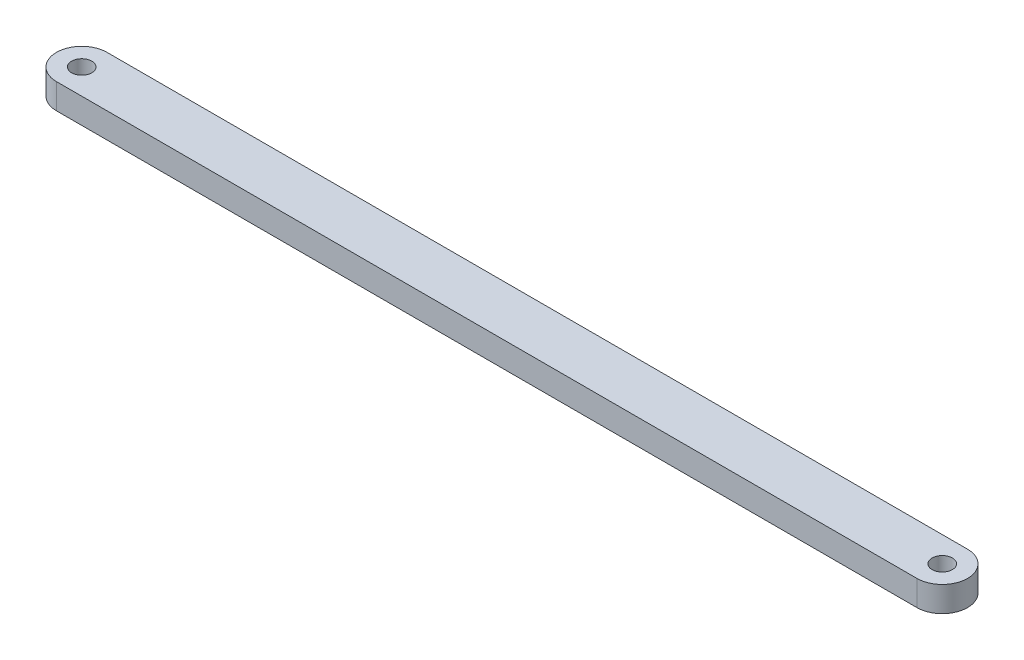
ISO-10303-21;
HEADER;
FILE_DESCRIPTION(('STEP AP214'),'2;1');
FILE_NAME('part.step','',(''),(''),'','','');
FILE_SCHEMA(('AUTOMOTIVE_DESIGN { 1 0 10303 214 1 1 1 1 }'));
ENDSEC;
DATA;
#1=APPLICATION_CONTEXT('core data for automotive mechanical design processes');
#2=APPLICATION_PROTOCOL_DEFINITION('international standard','automotive_design',2000,#1);
#3=PRODUCT_CONTEXT('',#1,'mechanical');
#4=PRODUCT('Part','Part','',(#3));
#5=PRODUCT_RELATED_PRODUCT_CATEGORY('part','',(#4));
#6=PRODUCT_DEFINITION_FORMATION('','',#4);
#7=PRODUCT_DEFINITION_CONTEXT('part definition',#1,'design');
#8=PRODUCT_DEFINITION('design','',#6,#7);
#9=PRODUCT_DEFINITION_SHAPE('','',#8);
#10=(LENGTH_UNIT() NAMED_UNIT(*) SI_UNIT(.MILLI.,.METRE.));
#11=(NAMED_UNIT(*) PLANE_ANGLE_UNIT() SI_UNIT($,.RADIAN.));
#12=(NAMED_UNIT(*) SI_UNIT($,.STERADIAN.) SOLID_ANGLE_UNIT());
#13=UNCERTAINTY_MEASURE_WITH_UNIT(LENGTH_MEASURE(1.E-05),#10,'distance_accuracy_value','');
#14=(GEOMETRIC_REPRESENTATION_CONTEXT(3) GLOBAL_UNCERTAINTY_ASSIGNED_CONTEXT((#13)) GLOBAL_UNIT_ASSIGNED_CONTEXT((#10,
#11,#12)) REPRESENTATION_CONTEXT('',''));
#15=CARTESIAN_POINT('',(0.,0.,0.));
#16=DIRECTION('',(0.,0.,1.));
#17=DIRECTION('',(1.,0.,0.));
#18=AXIS2_PLACEMENT_3D('',#15,#16,#17);
#19=CARTESIAN_POINT('',(0.,5.,-5.));
#20=DIRECTION('',(0.,-1.,0.));
#21=DIRECTION('',(0.,0.,-1.));
#22=AXIS2_PLACEMENT_3D('',#19,#20,#21);
#23=CYLINDRICAL_SURFACE('',#22,5.);
#24=CARTESIAN_POINT('',(0.,0.,-5.));
#25=DIRECTION('',(0.,1.,0.));
#26=DIRECTION('',(0.,0.,1.));
#27=AXIS2_PLACEMENT_3D('',#24,#25,#26);
#28=CIRCLE('',#27,5.);
#29=CARTESIAN_POINT('',(0.,0.,0.));
#30=VERTEX_POINT('',#29);
#31=CARTESIAN_POINT('',(0.,0.,-10.));
#32=VERTEX_POINT('',#31);
#33=EDGE_CURVE('E100',#30,#32,#28,.T.);
#34=ORIENTED_EDGE('',*,*,#33,.T.);
#35=DIRECTION('',(0.,-1.,0.));
#36=VECTOR('',#35,1.);
#37=CARTESIAN_POINT('',(0.,5.,-10.));
#38=LINE('',#37,#36);
#39=CARTESIAN_POINT('',(0.,5.,-10.));
#40=VERTEX_POINT('',#39);
#41=EDGE_CURVE('E11',#40,#32,#38,.T.);
#42=ORIENTED_EDGE('',*,*,#41,.F.);
#43=CARTESIAN_POINT('',(0.,5.,-5.));
#44=DIRECTION('',(0.,1.,0.));
#45=DIRECTION('',(0.,0.,1.));
#46=AXIS2_PLACEMENT_3D('',#43,#44,#45);
#47=CIRCLE('',#46,5.);
#48=CARTESIAN_POINT('',(0.,5.,0.));
#49=VERTEX_POINT('',#48);
#50=EDGE_CURVE('E88',#49,#40,#47,.T.);
#51=ORIENTED_EDGE('',*,*,#50,.F.);
#52=DIRECTION('',(0.,-1.,0.));
#53=VECTOR('',#52,1.);
#54=CARTESIAN_POINT('',(0.,5.,0.));
#55=LINE('',#54,#53);
#56=EDGE_CURVE('E96',#49,#30,#55,.T.);
#57=ORIENTED_EDGE('',*,*,#56,.T.);
#58=EDGE_LOOP('',(#34,#42,#51,#57));
#59=FACE_BOUND('',#58,.T.);
#60=ADVANCED_FACE('F37',(#59),#23,.T.);
#61=CARTESIAN_POINT('',(-170.,5.,-10.));
#62=DIRECTION('',(0.,0.,1.));
#63=DIRECTION('',(1.,0.,0.));
#64=AXIS2_PLACEMENT_3D('',#61,#62,#63);
#65=PLANE('',#64);
#66=DIRECTION('',(-1.,0.,0.));
#67=VECTOR('',#66,1.);
#68=CARTESIAN_POINT('',(-170.,0.,-10.));
#69=LINE('',#68,#67);
#70=CARTESIAN_POINT('',(-170.,0.,-10.));
#71=VERTEX_POINT('',#70);
#72=EDGE_CURVE('E92',#32,#71,#69,.T.);
#73=ORIENTED_EDGE('',*,*,#72,.T.);
#74=DIRECTION('',(0.,-1.,0.));
#75=VECTOR('',#74,1.);
#76=CARTESIAN_POINT('',(-170.,5.,-10.));
#77=LINE('',#76,#75);
#78=CARTESIAN_POINT('',(-170.,5.,-10.));
#79=VERTEX_POINT('',#78);
#80=EDGE_CURVE('E45',#79,#71,#77,.T.);
#81=ORIENTED_EDGE('',*,*,#80,.F.);
#82=DIRECTION('',(-1.,0.,0.));
#83=VECTOR('',#82,1.);
#84=CARTESIAN_POINT('',(-170.,5.,-10.));
#85=LINE('',#84,#83);
#86=EDGE_CURVE('E83',#40,#79,#85,.T.);
#87=ORIENTED_EDGE('',*,*,#86,.F.);
#88=ORIENTED_EDGE('',*,*,#41,.T.);
#89=EDGE_LOOP('',(#73,#81,#87,#88));
#90=FACE_BOUND('',#89,.T.);
#91=ADVANCED_FACE('F91',(#90),#65,.F.);
#92=CARTESIAN_POINT('',(-170.,5.,-4.99999999999999));
#93=DIRECTION('',(0.,-1.,0.));
#94=DIRECTION('',(0.,0.,-1.));
#95=AXIS2_PLACEMENT_3D('',#92,#93,#94);
#96=CYLINDRICAL_SURFACE('',#95,5.00000000000001);
#97=CARTESIAN_POINT('',(-170.,0.,-4.99999999999999));
#98=DIRECTION('',(0.,1.,0.));
#99=DIRECTION('',(0.,0.,1.));
#100=AXIS2_PLACEMENT_3D('',#97,#98,#99);
#101=CIRCLE('',#100,5.00000000000001);
#102=CARTESIAN_POINT('',(-170.,0.,0.));
#103=VERTEX_POINT('',#102);
#104=EDGE_CURVE('E70',#71,#103,#101,.T.);
#105=ORIENTED_EDGE('',*,*,#104,.T.);
#106=DIRECTION('',(0.,-1.,0.));
#107=VECTOR('',#106,1.);
#108=CARTESIAN_POINT('',(-170.,5.,0.));
#109=LINE('',#108,#107);
#110=CARTESIAN_POINT('',(-170.,5.,0.));
#111=VERTEX_POINT('',#110);
#112=EDGE_CURVE('E93',#111,#103,#109,.T.);
#113=ORIENTED_EDGE('',*,*,#112,.F.);
#114=CARTESIAN_POINT('',(-170.,5.,-4.99999999999999));
#115=DIRECTION('',(0.,1.,0.));
#116=DIRECTION('',(0.,0.,1.));
#117=AXIS2_PLACEMENT_3D('',#114,#115,#116);
#118=CIRCLE('',#117,5.00000000000001);
#119=EDGE_CURVE('E86',#79,#111,#118,.T.);
#120=ORIENTED_EDGE('',*,*,#119,.F.);
#121=ORIENTED_EDGE('',*,*,#80,.T.);
#122=EDGE_LOOP('',(#105,#113,#120,#121));
#123=FACE_BOUND('',#122,.T.);
#124=ADVANCED_FACE('F94',(#123),#96,.T.);
#125=CARTESIAN_POINT('',(0.,5.,0.));
#126=DIRECTION('',(0.,0.,-1.));
#127=DIRECTION('',(-1.,0.,0.));
#128=AXIS2_PLACEMENT_3D('',#125,#126,#127);
#129=PLANE('',#128);
#130=DIRECTION('',(1.,0.,0.));
#131=VECTOR('',#130,1.);
#132=CARTESIAN_POINT('',(0.,0.,0.));
#133=LINE('',#132,#131);
#134=EDGE_CURVE('E76',#103,#30,#133,.T.);
#135=ORIENTED_EDGE('',*,*,#134,.T.);
#136=ORIENTED_EDGE('',*,*,#56,.F.);
#137=DIRECTION('',(1.,0.,0.));
#138=VECTOR('',#137,1.);
#139=CARTESIAN_POINT('',(0.,5.,0.));
#140=LINE('',#139,#138);
#141=EDGE_CURVE('E53',#111,#49,#140,.T.);
#142=ORIENTED_EDGE('',*,*,#141,.F.);
#143=ORIENTED_EDGE('',*,*,#112,.T.);
#144=EDGE_LOOP('',(#135,#136,#142,#143));
#145=FACE_BOUND('',#144,.T.);
#146=ADVANCED_FACE('F108',(#145),#129,.F.);
#147=CARTESIAN_POINT('',(0.,5.,-5.));
#148=DIRECTION('',(0.,1.,0.));
#149=DIRECTION('',(0.,0.,1.));
#150=AXIS2_PLACEMENT_3D('',#147,#148,#149);
#151=PLANE('',#150);
#152=CARTESIAN_POINT('',(-170.,5.,-4.99999999999999));
#153=DIRECTION('',(0.,1.,0.));
#154=DIRECTION('',(0.,0.,1.));
#155=AXIS2_PLACEMENT_3D('',#152,#153,#154);
#156=CIRCLE('',#155,2.);
#157=CARTESIAN_POINT('',(-170.,5.,-2.99999999999999));
#158=VERTEX_POINT('',#157);
#159=EDGE_CURVE('E120',#158,#158,#156,.T.);
#160=ORIENTED_EDGE('',*,*,#159,.F.);
#161=EDGE_LOOP('',(#160));
#162=FACE_BOUND('',#161,.T.);
#163=CARTESIAN_POINT('',(0.,5.,-5.));
#164=DIRECTION('',(0.,1.,0.));
#165=DIRECTION('',(0.,0.,1.));
#166=AXIS2_PLACEMENT_3D('',#163,#164,#165);
#167=CIRCLE('',#166,2.);
#168=CARTESIAN_POINT('',(0.,5.,-3.));
#169=VERTEX_POINT('',#168);
#170=EDGE_CURVE('E117',#169,#169,#167,.T.);
#171=ORIENTED_EDGE('',*,*,#170,.F.);
#172=EDGE_LOOP('',(#171));
#173=FACE_BOUND('',#172,.T.);
#174=ORIENTED_EDGE('',*,*,#50,.T.);
#175=ORIENTED_EDGE('',*,*,#86,.T.);
#176=ORIENTED_EDGE('',*,*,#119,.T.);
#177=ORIENTED_EDGE('',*,*,#141,.T.);
#178=EDGE_LOOP('',(#174,#175,#176,#177));
#179=FACE_BOUND('',#178,.T.);
#180=ADVANCED_FACE('F84',(#162,#173,#179),#151,.T.);
#181=CARTESIAN_POINT('',(0.,0.,-5.));
#182=DIRECTION('',(0.,1.,0.));
#183=DIRECTION('',(0.,0.,1.));
#184=AXIS2_PLACEMENT_3D('',#181,#182,#183);
#185=PLANE('',#184);
#186=CARTESIAN_POINT('',(-170.,0.,-4.99999999999999));
#187=DIRECTION('',(0.,1.,0.));
#188=DIRECTION('',(0.,0.,1.));
#189=AXIS2_PLACEMENT_3D('',#186,#187,#188);
#190=CIRCLE('',#189,2.);
#191=CARTESIAN_POINT('',(-170.,0.,-2.99999999999999));
#192=VERTEX_POINT('',#191);
#193=EDGE_CURVE('E103',#192,#192,#190,.T.);
#194=ORIENTED_EDGE('',*,*,#193,.T.);
#195=EDGE_LOOP('',(#194));
#196=FACE_BOUND('',#195,.T.);
#197=CARTESIAN_POINT('',(0.,0.,-5.));
#198=DIRECTION('',(0.,1.,0.));
#199=DIRECTION('',(0.,0.,1.));
#200=AXIS2_PLACEMENT_3D('',#197,#198,#199);
#201=CIRCLE('',#200,2.);
#202=CARTESIAN_POINT('',(0.,0.,-3.));
#203=VERTEX_POINT('',#202);
#204=EDGE_CURVE('E114',#203,#203,#201,.T.);
#205=ORIENTED_EDGE('',*,*,#204,.T.);
#206=EDGE_LOOP('',(#205));
#207=FACE_BOUND('',#206,.T.);
#208=ORIENTED_EDGE('',*,*,#33,.F.);
#209=ORIENTED_EDGE('',*,*,#134,.F.);
#210=ORIENTED_EDGE('',*,*,#104,.F.);
#211=ORIENTED_EDGE('',*,*,#72,.F.);
#212=EDGE_LOOP('',(#208,#209,#210,#211));
#213=FACE_BOUND('',#212,.T.);
#214=ADVANCED_FACE('F111',(#196,#207,#213),#185,.F.);
#215=CARTESIAN_POINT('',(0.,0.,-5.));
#216=DIRECTION('',(0.,1.,0.));
#217=DIRECTION('',(0.,0.,1.));
#218=AXIS2_PLACEMENT_3D('',#215,#216,#217);
#219=CYLINDRICAL_SURFACE('',#218,2.);
#220=ORIENTED_EDGE('',*,*,#204,.F.);
#221=EDGE_LOOP('',(#220));
#222=FACE_BOUND('',#221,.T.);
#223=ORIENTED_EDGE('',*,*,#170,.T.);
#224=EDGE_LOOP('',(#223));
#225=FACE_BOUND('',#224,.T.);
#226=ADVANCED_FACE('F131',(#222,#225),#219,.F.);
#227=CARTESIAN_POINT('',(-170.,0.,-4.99999999999999));
#228=DIRECTION('',(0.,1.,0.));
#229=DIRECTION('',(0.,0.,1.));
#230=AXIS2_PLACEMENT_3D('',#227,#228,#229);
#231=CYLINDRICAL_SURFACE('',#230,2.);
#232=ORIENTED_EDGE('',*,*,#193,.F.);
#233=EDGE_LOOP('',(#232));
#234=FACE_BOUND('',#233,.T.);
#235=ORIENTED_EDGE('',*,*,#159,.T.);
#236=EDGE_LOOP('',(#235));
#237=FACE_BOUND('',#236,.T.);
#238=ADVANCED_FACE('F128',(#234,#237),#231,.F.);
#239=CLOSED_SHELL('',(#60,#91,#124,#146,#180,#214,#226,#238));
#240=MANIFOLD_SOLID_BREP('B2',#239);
#241=ADVANCED_BREP_SHAPE_REPRESENTATION('',(#18,#240),#14);
#242=SHAPE_DEFINITION_REPRESENTATION(#9,#241);
ENDSEC;
END-ISO-10303-21;
